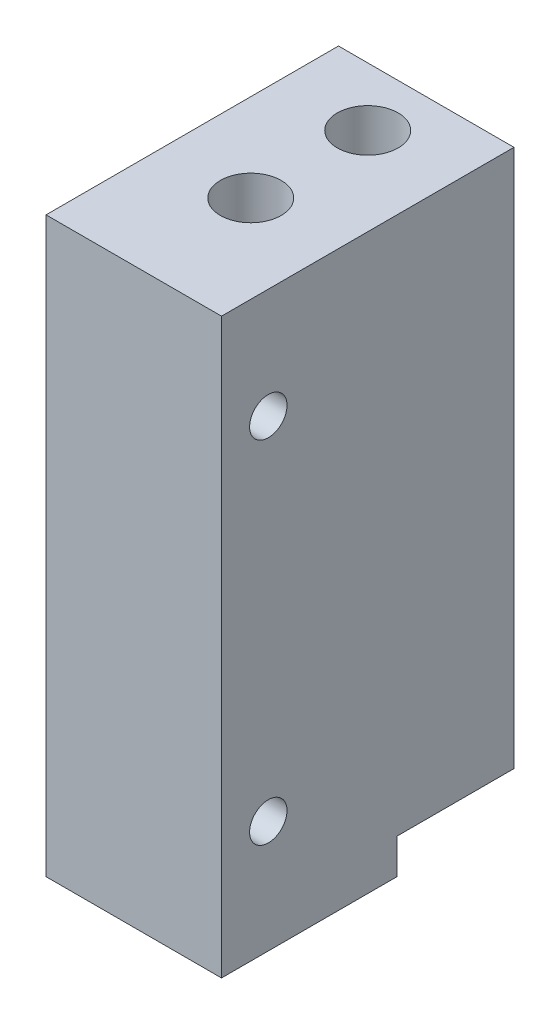
ISO-10303-21;
HEADER;
FILE_DESCRIPTION(('STEP AP214'),'2;1');
FILE_NAME('part.step','',(''),(''),'','','');
FILE_SCHEMA(('AUTOMOTIVE_DESIGN { 1 0 10303 214 1 1 1 1 }'));
ENDSEC;
DATA;
#1=APPLICATION_CONTEXT('core data for automotive mechanical design processes');
#2=APPLICATION_PROTOCOL_DEFINITION('international standard','automotive_design',2000,#1);
#3=PRODUCT_CONTEXT('',#1,'mechanical');
#4=PRODUCT('Part','Part','',(#3));
#5=PRODUCT_RELATED_PRODUCT_CATEGORY('part','',(#4));
#6=PRODUCT_DEFINITION_FORMATION('','',#4);
#7=PRODUCT_DEFINITION_CONTEXT('part definition',#1,'design');
#8=PRODUCT_DEFINITION('design','',#6,#7);
#9=PRODUCT_DEFINITION_SHAPE('','',#8);
#10=(LENGTH_UNIT() NAMED_UNIT(*) SI_UNIT(.MILLI.,.METRE.));
#11=(NAMED_UNIT(*) PLANE_ANGLE_UNIT() SI_UNIT($,.RADIAN.));
#12=(NAMED_UNIT(*) SI_UNIT($,.STERADIAN.) SOLID_ANGLE_UNIT());
#13=UNCERTAINTY_MEASURE_WITH_UNIT(LENGTH_MEASURE(1.E-05),#10,'distance_accuracy_value','');
#14=(GEOMETRIC_REPRESENTATION_CONTEXT(3) GLOBAL_UNCERTAINTY_ASSIGNED_CONTEXT((#13)) GLOBAL_UNIT_ASSIGNED_CONTEXT((#10,
#11,#12)) REPRESENTATION_CONTEXT('',''));
#15=CARTESIAN_POINT('',(0.,0.,0.));
#16=DIRECTION('',(0.,0.,1.));
#17=DIRECTION('',(1.,0.,0.));
#18=AXIS2_PLACEMENT_3D('',#15,#16,#17);
#19=CARTESIAN_POINT('',(15.,0.,0.));
#20=DIRECTION('',(0.,0.,1.));
#21=DIRECTION('',(0.,-1.,0.));
#22=AXIS2_PLACEMENT_3D('',#19,#20,#21);
#23=PLANE('',#22);
#24=DIRECTION('',(-1.,0.,0.));
#25=VECTOR('',#24,1.);
#26=CARTESIAN_POINT('',(15.,3.,0.));
#27=LINE('',#26,#25);
#28=CARTESIAN_POINT('',(15.,3.,0.));
#29=VERTEX_POINT('',#28);
#30=CARTESIAN_POINT('',(0.,3.,0.));
#31=VERTEX_POINT('',#30);
#32=EDGE_CURVE('E58',#29,#31,#27,.T.);
#33=ORIENTED_EDGE('',*,*,#32,.F.);
#34=DIRECTION('',(0.,1.,0.));
#35=VECTOR('',#34,1.);
#36=CARTESIAN_POINT('',(15.,0.,0.));
#37=LINE('',#36,#35);
#38=CARTESIAN_POINT('',(15.,0.,0.));
#39=VERTEX_POINT('',#38);
#40=EDGE_CURVE('E127',#39,#29,#37,.T.);
#41=ORIENTED_EDGE('',*,*,#40,.F.);
#42=DIRECTION('',(-1.,0.,0.));
#43=VECTOR('',#42,1.);
#44=CARTESIAN_POINT('',(15.,0.,0.));
#45=LINE('',#44,#43);
#46=CARTESIAN_POINT('',(0.,0.,0.));
#47=VERTEX_POINT('',#46);
#48=EDGE_CURVE('E168',#39,#47,#45,.T.);
#49=ORIENTED_EDGE('',*,*,#48,.T.);
#50=DIRECTION('',(0.,1.,0.));
#51=VECTOR('',#50,1.);
#52=CARTESIAN_POINT('',(0.,0.,0.));
#53=LINE('',#52,#51);
#54=EDGE_CURVE('E155',#47,#31,#53,.T.);
#55=ORIENTED_EDGE('',*,*,#54,.T.);
#56=EDGE_LOOP('',(#33,#41,#49,#55));
#57=FACE_BOUND('',#56,.T.);
#58=ADVANCED_FACE('F43',(#57),#23,.F.);
#59=CARTESIAN_POINT('',(15.,0.,0.));
#60=DIRECTION('',(1.,0.,0.));
#61=DIRECTION('',(0.,0.,-1.));
#62=AXIS2_PLACEMENT_3D('',#59,#60,#61);
#63=PLANE('',#62);
#64=CARTESIAN_POINT('',(15.,39.6,11.));
#65=DIRECTION('',(1.,0.,0.));
#66=DIRECTION('',(0.,0.,-1.));
#67=AXIS2_PLACEMENT_3D('',#64,#65,#66);
#68=CIRCLE('',#67,1.6);
#69=CARTESIAN_POINT('',(15.,39.6,9.4));
#70=VERTEX_POINT('',#69);
#71=EDGE_CURVE('E151',#70,#70,#68,.T.);
#72=ORIENTED_EDGE('',*,*,#71,.F.);
#73=EDGE_LOOP('',(#72));
#74=FACE_BOUND('',#73,.T.);
#75=ORIENTED_EDGE('',*,*,#40,.T.);
#76=DIRECTION('',(0.,0.,1.));
#77=VECTOR('',#76,1.);
#78=CARTESIAN_POINT('',(15.,3.,-10.));
#79=LINE('',#78,#77);
#80=CARTESIAN_POINT('',(15.,3.,-10.));
#81=VERTEX_POINT('',#80);
#82=EDGE_CURVE('E109',#81,#29,#79,.T.);
#83=ORIENTED_EDGE('',*,*,#82,.F.);
#84=DIRECTION('',(0.,-1.,0.));
#85=VECTOR('',#84,1.);
#86=CARTESIAN_POINT('',(15.,49.,-10.));
#87=LINE('',#86,#85);
#88=CARTESIAN_POINT('',(15.,49.,-10.));
#89=VERTEX_POINT('',#88);
#90=EDGE_CURVE('E117',#89,#81,#87,.T.);
#91=ORIENTED_EDGE('',*,*,#90,.F.);
#92=DIRECTION('',(0.,0.,1.));
#93=VECTOR('',#92,1.);
#94=CARTESIAN_POINT('',(15.,49.,0.));
#95=LINE('',#94,#93);
#96=CARTESIAN_POINT('',(15.,49.,15.));
#97=VERTEX_POINT('',#96);
#98=EDGE_CURVE('E88',#89,#97,#95,.T.);
#99=ORIENTED_EDGE('',*,*,#98,.T.);
#100=DIRECTION('',(0.,-1.,0.));
#101=VECTOR('',#100,1.);
#102=CARTESIAN_POINT('',(15.,0.,15.));
#103=LINE('',#102,#101);
#104=CARTESIAN_POINT('',(15.,0.,15.));
#105=VERTEX_POINT('',#104);
#106=EDGE_CURVE('E163',#97,#105,#103,.T.);
#107=ORIENTED_EDGE('',*,*,#106,.T.);
#108=DIRECTION('',(0.,0.,-1.));
#109=VECTOR('',#108,1.);
#110=CARTESIAN_POINT('',(15.,0.,0.));
#111=LINE('',#110,#109);
#112=EDGE_CURVE('E66',#105,#39,#111,.T.);
#113=ORIENTED_EDGE('',*,*,#112,.T.);
#114=EDGE_LOOP('',(#75,#83,#91,#99,#107,#113));
#115=FACE_BOUND('',#114,.T.);
#116=CARTESIAN_POINT('',(15.,9.6,11.));
#117=DIRECTION('',(1.,0.,0.));
#118=DIRECTION('',(0.,0.,-1.));
#119=AXIS2_PLACEMENT_3D('',#116,#117,#118);
#120=CIRCLE('',#119,1.6);
#121=CARTESIAN_POINT('',(15.,9.6,9.39999999999999));
#122=VERTEX_POINT('',#121);
#123=EDGE_CURVE('E143',#122,#122,#120,.T.);
#124=ORIENTED_EDGE('',*,*,#123,.F.);
#125=EDGE_LOOP('',(#124));
#126=FACE_BOUND('',#125,.T.);
#127=ADVANCED_FACE('F125',(#74,#115,#126),#63,.T.);
#128=CARTESIAN_POINT('',(0.,0.,0.));
#129=DIRECTION('',(1.,0.,0.));
#130=DIRECTION('',(0.,0.,-1.));
#131=AXIS2_PLACEMENT_3D('',#128,#129,#130);
#132=PLANE('',#131);
#133=ORIENTED_EDGE('',*,*,#54,.F.);
#134=DIRECTION('',(0.,0.,-1.));
#135=VECTOR('',#134,1.);
#136=CARTESIAN_POINT('',(0.,0.,0.));
#137=LINE('',#136,#135);
#138=CARTESIAN_POINT('',(0.,0.,15.));
#139=VERTEX_POINT('',#138);
#140=EDGE_CURVE('E83',#139,#47,#137,.T.);
#141=ORIENTED_EDGE('',*,*,#140,.F.);
#142=DIRECTION('',(0.,-1.,0.));
#143=VECTOR('',#142,1.);
#144=CARTESIAN_POINT('',(0.,0.,15.));
#145=LINE('',#144,#143);
#146=CARTESIAN_POINT('',(0.,49.,15.));
#147=VERTEX_POINT('',#146);
#148=EDGE_CURVE('E174',#147,#139,#145,.T.);
#149=ORIENTED_EDGE('',*,*,#148,.F.);
#150=DIRECTION('',(0.,0.,1.));
#151=VECTOR('',#150,1.);
#152=CARTESIAN_POINT('',(0.,49.,0.));
#153=LINE('',#152,#151);
#154=CARTESIAN_POINT('',(0.,49.,-10.));
#155=VERTEX_POINT('',#154);
#156=EDGE_CURVE('E171',#155,#147,#153,.T.);
#157=ORIENTED_EDGE('',*,*,#156,.F.);
#158=DIRECTION('',(0.,1.,0.));
#159=VECTOR('',#158,1.);
#160=CARTESIAN_POINT('',(0.,49.,-10.));
#161=LINE('',#160,#159);
#162=CARTESIAN_POINT('',(0.,3.,-10.));
#163=VERTEX_POINT('',#162);
#164=EDGE_CURVE('E116',#163,#155,#161,.T.);
#165=ORIENTED_EDGE('',*,*,#164,.F.);
#166=DIRECTION('',(0.,0.,1.));
#167=VECTOR('',#166,1.);
#168=CARTESIAN_POINT('',(0.,3.,-10.));
#169=LINE('',#168,#167);
#170=EDGE_CURVE('E111',#163,#31,#169,.T.);
#171=ORIENTED_EDGE('',*,*,#170,.T.);
#172=EDGE_LOOP('',(#133,#141,#149,#157,#165,#171));
#173=FACE_BOUND('',#172,.T.);
#174=CARTESIAN_POINT('',(0.,39.6,11.));
#175=DIRECTION('',(1.,0.,0.));
#176=DIRECTION('',(0.,0.,-1.));
#177=AXIS2_PLACEMENT_3D('',#174,#175,#176);
#178=CIRCLE('',#177,1.6);
#179=CARTESIAN_POINT('',(0.,39.6,9.4));
#180=VERTEX_POINT('',#179);
#181=EDGE_CURVE('E147',#180,#180,#178,.T.);
#182=ORIENTED_EDGE('',*,*,#181,.T.);
#183=EDGE_LOOP('',(#182));
#184=FACE_BOUND('',#183,.T.);
#185=CARTESIAN_POINT('',(0.,9.6,11.));
#186=DIRECTION('',(1.,0.,0.));
#187=DIRECTION('',(0.,0.,-1.));
#188=AXIS2_PLACEMENT_3D('',#185,#186,#187);
#189=CIRCLE('',#188,1.6);
#190=CARTESIAN_POINT('',(0.,9.6,9.39999999999999));
#191=VERTEX_POINT('',#190);
#192=EDGE_CURVE('E141',#191,#191,#189,.T.);
#193=ORIENTED_EDGE('',*,*,#192,.T.);
#194=EDGE_LOOP('',(#193));
#195=FACE_BOUND('',#194,.T.);
#196=ADVANCED_FACE('F188',(#173,#184,#195),#132,.F.);
#197=CARTESIAN_POINT('',(15.,49.,0.));
#198=DIRECTION('',(0.,-1.,0.));
#199=DIRECTION('',(0.,0.,-1.));
#200=AXIS2_PLACEMENT_3D('',#197,#198,#199);
#201=PLANE('',#200);
#202=CARTESIAN_POINT('',(7.5,49.,-5.));
#203=DIRECTION('',(0.,-1.,0.));
#204=DIRECTION('',(0.,0.,-1.));
#205=AXIS2_PLACEMENT_3D('',#202,#203,#204);
#206=CIRCLE('',#205,2.6);
#207=CARTESIAN_POINT('',(7.5,49.,-7.6));
#208=VERTEX_POINT('',#207);
#209=EDGE_CURVE('E191',#208,#208,#206,.T.);
#210=ORIENTED_EDGE('',*,*,#209,.T.);
#211=EDGE_LOOP('',(#210));
#212=FACE_BOUND('',#211,.T.);
#213=CARTESIAN_POINT('',(7.5,49.,5.00000000000001));
#214=DIRECTION('',(0.,-1.,0.));
#215=DIRECTION('',(0.,0.,-1.));
#216=AXIS2_PLACEMENT_3D('',#213,#214,#215);
#217=CIRCLE('',#216,2.6);
#218=CARTESIAN_POINT('',(7.5,49.,2.40000000000001));
#219=VERTEX_POINT('',#218);
#220=EDGE_CURVE('E134',#219,#219,#217,.T.);
#221=ORIENTED_EDGE('',*,*,#220,.T.);
#222=EDGE_LOOP('',(#221));
#223=FACE_BOUND('',#222,.T.);
#224=ORIENTED_EDGE('',*,*,#156,.T.);
#225=DIRECTION('',(-1.,0.,0.));
#226=VECTOR('',#225,1.);
#227=CARTESIAN_POINT('',(15.,49.,15.));
#228=LINE('',#227,#226);
#229=EDGE_CURVE('E11',#97,#147,#228,.T.);
#230=ORIENTED_EDGE('',*,*,#229,.F.);
#231=ORIENTED_EDGE('',*,*,#98,.F.);
#232=DIRECTION('',(1.,0.,0.));
#233=VECTOR('',#232,1.);
#234=CARTESIAN_POINT('',(15.,49.,-10.));
#235=LINE('',#234,#233);
#236=EDGE_CURVE('E122',#155,#89,#235,.T.);
#237=ORIENTED_EDGE('',*,*,#236,.F.);
#238=EDGE_LOOP('',(#224,#230,#231,#237));
#239=FACE_BOUND('',#238,.T.);
#240=ADVANCED_FACE('F227',(#212,#223,#239),#201,.F.);
#241=CARTESIAN_POINT('',(15.,0.,15.));
#242=DIRECTION('',(0.,0.,-1.));
#243=DIRECTION('',(-1.,0.,0.));
#244=AXIS2_PLACEMENT_3D('',#241,#242,#243);
#245=PLANE('',#244);
#246=ORIENTED_EDGE('',*,*,#148,.T.);
#247=DIRECTION('',(-1.,0.,0.));
#248=VECTOR('',#247,1.);
#249=CARTESIAN_POINT('',(15.,0.,15.));
#250=LINE('',#249,#248);
#251=EDGE_CURVE('E51',#105,#139,#250,.T.);
#252=ORIENTED_EDGE('',*,*,#251,.F.);
#253=ORIENTED_EDGE('',*,*,#106,.F.);
#254=ORIENTED_EDGE('',*,*,#229,.T.);
#255=EDGE_LOOP('',(#246,#252,#253,#254));
#256=FACE_BOUND('',#255,.T.);
#257=ADVANCED_FACE('F236',(#256),#245,.F.);
#258=CARTESIAN_POINT('',(15.,0.,0.));
#259=DIRECTION('',(0.,1.,0.));
#260=DIRECTION('',(0.,0.,1.));
#261=AXIS2_PLACEMENT_3D('',#258,#259,#260);
#262=PLANE('',#261);
#263=CARTESIAN_POINT('',(7.5,0.,5.));
#264=DIRECTION('',(0.,-1.,0.));
#265=DIRECTION('',(0.,0.,-1.));
#266=AXIS2_PLACEMENT_3D('',#263,#264,#265);
#267=CIRCLE('',#266,2.6);
#268=CARTESIAN_POINT('',(7.5,0.,2.4));
#269=VERTEX_POINT('',#268);
#270=EDGE_CURVE('E129',#269,#269,#267,.T.);
#271=ORIENTED_EDGE('',*,*,#270,.F.);
#272=EDGE_LOOP('',(#271));
#273=FACE_BOUND('',#272,.T.);
#274=ORIENTED_EDGE('',*,*,#140,.T.);
#275=ORIENTED_EDGE('',*,*,#48,.F.);
#276=ORIENTED_EDGE('',*,*,#112,.F.);
#277=ORIENTED_EDGE('',*,*,#251,.T.);
#278=EDGE_LOOP('',(#274,#275,#276,#277));
#279=FACE_BOUND('',#278,.T.);
#280=ADVANCED_FACE('F182',(#273,#279),#262,.F.);
#281=CARTESIAN_POINT('',(15.,39.6,11.));
#282=DIRECTION('',(-1.,0.,0.));
#283=DIRECTION('',(0.,0.,1.));
#284=AXIS2_PLACEMENT_3D('',#281,#282,#283);
#285=CYLINDRICAL_SURFACE('',#284,1.6);
#286=ORIENTED_EDGE('',*,*,#71,.T.);
#287=EDGE_LOOP('',(#286));
#288=FACE_BOUND('',#287,.T.);
#289=ORIENTED_EDGE('',*,*,#181,.F.);
#290=EDGE_LOOP('',(#289));
#291=FACE_BOUND('',#290,.T.);
#292=ADVANCED_FACE('F231',(#288,#291),#285,.F.);
#293=CARTESIAN_POINT('',(15.,9.6,11.));
#294=DIRECTION('',(-1.,0.,0.));
#295=DIRECTION('',(0.,0.,1.));
#296=AXIS2_PLACEMENT_3D('',#293,#294,#295);
#297=CYLINDRICAL_SURFACE('',#296,1.6);
#298=ORIENTED_EDGE('',*,*,#123,.T.);
#299=EDGE_LOOP('',(#298));
#300=FACE_BOUND('',#299,.T.);
#301=ORIENTED_EDGE('',*,*,#192,.F.);
#302=EDGE_LOOP('',(#301));
#303=FACE_BOUND('',#302,.T.);
#304=ADVANCED_FACE('F215',(#300,#303),#297,.F.);
#305=CARTESIAN_POINT('',(7.5,49.,5.00000000000001));
#306=DIRECTION('',(0.,-1.,0.));
#307=DIRECTION('',(0.,0.,-1.));
#308=AXIS2_PLACEMENT_3D('',#305,#306,#307);
#309=CYLINDRICAL_SURFACE('',#308,2.6);
#310=ORIENTED_EDGE('',*,*,#220,.F.);
#311=EDGE_LOOP('',(#310));
#312=FACE_BOUND('',#311,.T.);
#313=ORIENTED_EDGE('',*,*,#270,.T.);
#314=EDGE_LOOP('',(#313));
#315=FACE_BOUND('',#314,.T.);
#316=ADVANCED_FACE('F208',(#312,#315),#309,.F.);
#317=CARTESIAN_POINT('',(15.,3.,-10.));
#318=DIRECTION('',(0.,1.,0.));
#319=DIRECTION('',(0.,0.,1.));
#320=AXIS2_PLACEMENT_3D('',#317,#318,#319);
#321=PLANE('',#320);
#322=CARTESIAN_POINT('',(7.5,3.,-5.));
#323=DIRECTION('',(0.,-1.,0.));
#324=DIRECTION('',(0.,0.,-1.));
#325=AXIS2_PLACEMENT_3D('',#322,#323,#324);
#326=CIRCLE('',#325,2.6);
#327=CARTESIAN_POINT('',(7.5,3.,-7.6));
#328=VERTEX_POINT('',#327);
#329=EDGE_CURVE('E194',#328,#328,#326,.T.);
#330=ORIENTED_EDGE('',*,*,#329,.F.);
#331=EDGE_LOOP('',(#330));
#332=FACE_BOUND('',#331,.T.);
#333=ORIENTED_EDGE('',*,*,#32,.T.);
#334=ORIENTED_EDGE('',*,*,#170,.F.);
#335=DIRECTION('',(-1.,0.,0.));
#336=VECTOR('',#335,1.);
#337=CARTESIAN_POINT('',(15.,3.,-10.));
#338=LINE('',#337,#336);
#339=EDGE_CURVE('E105',#81,#163,#338,.T.);
#340=ORIENTED_EDGE('',*,*,#339,.F.);
#341=ORIENTED_EDGE('',*,*,#82,.T.);
#342=EDGE_LOOP('',(#333,#334,#340,#341));
#343=FACE_BOUND('',#342,.T.);
#344=ADVANCED_FACE('F107',(#332,#343),#321,.F.);
#345=CARTESIAN_POINT('',(0.,0.,-10.));
#346=DIRECTION('',(0.,0.,-1.));
#347=DIRECTION('',(0.,1.,0.));
#348=AXIS2_PLACEMENT_3D('',#345,#346,#347);
#349=PLANE('',#348);
#350=ORIENTED_EDGE('',*,*,#90,.T.);
#351=ORIENTED_EDGE('',*,*,#339,.T.);
#352=ORIENTED_EDGE('',*,*,#164,.T.);
#353=ORIENTED_EDGE('',*,*,#236,.T.);
#354=EDGE_LOOP('',(#350,#351,#352,#353));
#355=FACE_BOUND('',#354,.T.);
#356=ADVANCED_FACE('F120',(#355),#349,.T.);
#357=CARTESIAN_POINT('',(7.5,49.,-5.));
#358=DIRECTION('',(0.,-1.,0.));
#359=DIRECTION('',(0.,0.,-1.));
#360=AXIS2_PLACEMENT_3D('',#357,#358,#359);
#361=CYLINDRICAL_SURFACE('',#360,2.6);
#362=ORIENTED_EDGE('',*,*,#209,.F.);
#363=EDGE_LOOP('',(#362));
#364=FACE_BOUND('',#363,.T.);
#365=ORIENTED_EDGE('',*,*,#329,.T.);
#366=EDGE_LOOP('',(#365));
#367=FACE_BOUND('',#366,.T.);
#368=ADVANCED_FACE('F205',(#364,#367),#361,.F.);
#369=CLOSED_SHELL('',(#58,#127,#196,#240,#257,#280,#292,#304,#316,#344,#356,#368));
#370=MANIFOLD_SOLID_BREP('B2',#369);
#371=ADVANCED_BREP_SHAPE_REPRESENTATION('',(#18,#370),#14);
#372=SHAPE_DEFINITION_REPRESENTATION(#9,#371);
ENDSEC;
END-ISO-10303-21;
